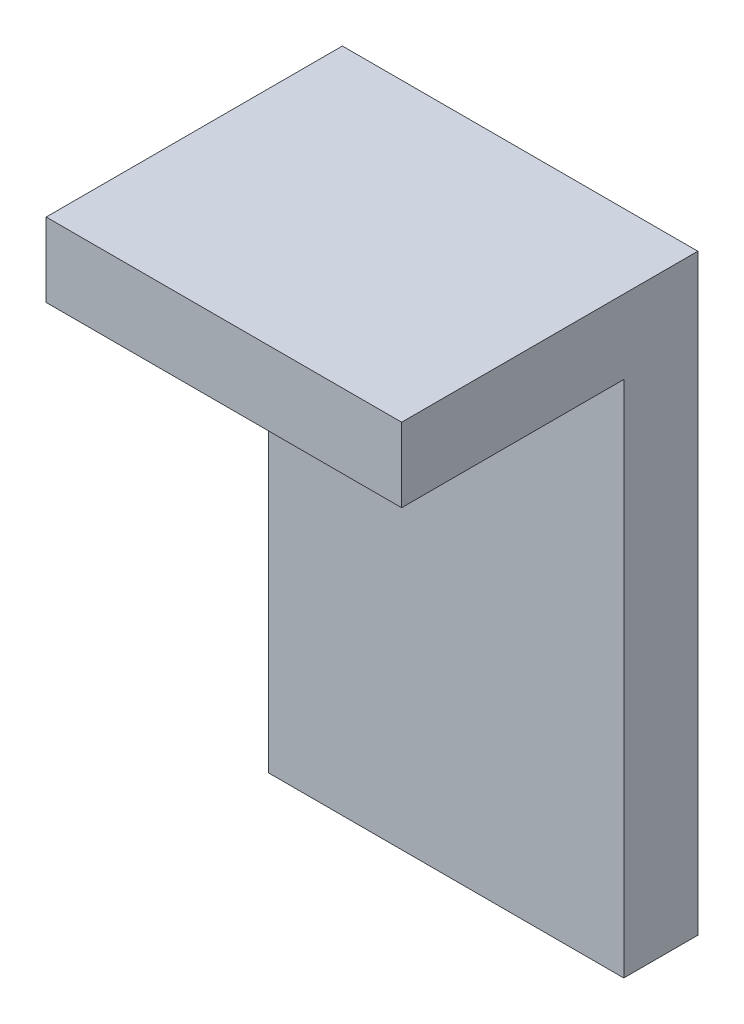
ISO-10303-21;
HEADER;
FILE_DESCRIPTION(('STEP AP214'),'2;1');
FILE_NAME('part.step','',(''),(''),'','','');
FILE_SCHEMA(('AUTOMOTIVE_DESIGN { 1 0 10303 214 1 1 1 1 }'));
ENDSEC;
DATA;
#1=APPLICATION_CONTEXT('core data for automotive mechanical design processes');
#2=APPLICATION_PROTOCOL_DEFINITION('international standard','automotive_design',2000,#1);
#3=PRODUCT_CONTEXT('',#1,'mechanical');
#4=PRODUCT('Part','Part','',(#3));
#5=PRODUCT_RELATED_PRODUCT_CATEGORY('part','',(#4));
#6=PRODUCT_DEFINITION_FORMATION('','',#4);
#7=PRODUCT_DEFINITION_CONTEXT('part definition',#1,'design');
#8=PRODUCT_DEFINITION('design','',#6,#7);
#9=PRODUCT_DEFINITION_SHAPE('','',#8);
#10=(LENGTH_UNIT() NAMED_UNIT(*) SI_UNIT(.MILLI.,.METRE.));
#11=(NAMED_UNIT(*) PLANE_ANGLE_UNIT() SI_UNIT($,.RADIAN.));
#12=(NAMED_UNIT(*) SI_UNIT($,.STERADIAN.) SOLID_ANGLE_UNIT());
#13=UNCERTAINTY_MEASURE_WITH_UNIT(LENGTH_MEASURE(1.E-05),#10,'distance_accuracy_value','');
#14=(GEOMETRIC_REPRESENTATION_CONTEXT(3) GLOBAL_UNCERTAINTY_ASSIGNED_CONTEXT((#13)) GLOBAL_UNIT_ASSIGNED_CONTEXT((#10,
#11,#12)) REPRESENTATION_CONTEXT('',''));
#15=CARTESIAN_POINT('',(0.,0.,0.));
#16=DIRECTION('',(0.,0.,1.));
#17=DIRECTION('',(1.,0.,0.));
#18=AXIS2_PLACEMENT_3D('',#15,#16,#17);
#19=CARTESIAN_POINT('',(1.12,1.1,0.));
#20=DIRECTION('',(0.,0.,1.));
#21=DIRECTION('',(0.,-1.,0.));
#22=AXIS2_PLACEMENT_3D('',#19,#20,#21);
#23=PLANE('',#22);
#24=DIRECTION('',(1.,0.,0.));
#25=VECTOR('',#24,1.);
#26=CARTESIAN_POINT('',(1.12,1.1,0.));
#27=LINE('',#26,#25);
#28=CARTESIAN_POINT('',(0.88,1.1,0.));
#29=VERTEX_POINT('',#28);
#30=CARTESIAN_POINT('',(1.12,1.1,0.));
#31=VERTEX_POINT('',#30);
#32=EDGE_CURVE('E109',#29,#31,#27,.T.);
#33=ORIENTED_EDGE('',*,*,#32,.T.);
#34=DIRECTION('',(0.,1.,0.));
#35=VECTOR('',#34,1.);
#36=CARTESIAN_POINT('',(1.12,1.1,0.));
#37=LINE('',#36,#35);
#38=CARTESIAN_POINT('',(1.12,1.45,0.));
#39=VERTEX_POINT('',#38);
#40=EDGE_CURVE('E101',#31,#39,#37,.T.);
#41=ORIENTED_EDGE('',*,*,#40,.T.);
#42=DIRECTION('',(1.,0.,0.));
#43=VECTOR('',#42,1.);
#44=CARTESIAN_POINT('',(0.88,1.45,0.));
#45=LINE('',#44,#43);
#46=CARTESIAN_POINT('',(0.88,1.45,0.));
#47=VERTEX_POINT('',#46);
#48=EDGE_CURVE('E20',#39,#47,#45,.F.);
#49=ORIENTED_EDGE('',*,*,#48,.T.);
#50=DIRECTION('',(0.,1.,0.));
#51=VECTOR('',#50,1.);
#52=CARTESIAN_POINT('',(0.88,1.1,0.));
#53=LINE('',#52,#51);
#54=EDGE_CURVE('E99',#47,#29,#53,.F.);
#55=ORIENTED_EDGE('',*,*,#54,.T.);
#56=EDGE_LOOP('',(#33,#41,#49,#55));
#57=FACE_BOUND('',#56,.T.);
#58=ADVANCED_FACE('F17',(#57),#23,.T.);
#59=CARTESIAN_POINT('',(0.88,1.45,0.15));
#60=DIRECTION('',(0.,1.,0.));
#61=DIRECTION('',(0.,0.,1.));
#62=AXIS2_PLACEMENT_3D('',#59,#60,#61);
#63=PLANE('',#62);
#64=DIRECTION('',(0.,0.,1.));
#65=VECTOR('',#64,1.);
#66=CARTESIAN_POINT('',(1.12,1.45,-0.05));
#67=LINE('',#66,#65);
#68=CARTESIAN_POINT('',(1.12,1.45,0.15));
#69=VERTEX_POINT('',#68);
#70=EDGE_CURVE('E113',#39,#69,#67,.T.);
#71=ORIENTED_EDGE('',*,*,#70,.T.);
#72=DIRECTION('',(1.,0.,0.));
#73=VECTOR('',#72,1.);
#74=CARTESIAN_POINT('',(1.12,1.45,0.15));
#75=LINE('',#74,#73);
#76=CARTESIAN_POINT('',(0.88,1.45,0.15));
#77=VERTEX_POINT('',#76);
#78=EDGE_CURVE('E67',#69,#77,#75,.F.);
#79=ORIENTED_EDGE('',*,*,#78,.T.);
#80=DIRECTION('',(0.,0.,-1.));
#81=VECTOR('',#80,1.);
#82=CARTESIAN_POINT('',(0.88,1.45,-0.05));
#83=LINE('',#82,#81);
#84=EDGE_CURVE('E90',#77,#47,#83,.T.);
#85=ORIENTED_EDGE('',*,*,#84,.T.);
#86=ORIENTED_EDGE('',*,*,#48,.F.);
#87=EDGE_LOOP('',(#71,#79,#85,#86));
#88=FACE_BOUND('',#87,.T.);
#89=ADVANCED_FACE('F106',(#88),#63,.F.);
#90=CARTESIAN_POINT('',(1.12,1.1,0.15));
#91=DIRECTION('',(0.,0.,-1.));
#92=DIRECTION('',(0.,1.,0.));
#93=AXIS2_PLACEMENT_3D('',#90,#91,#92);
#94=PLANE('',#93);
#95=DIRECTION('',(0.,1.,0.));
#96=VECTOR('',#95,1.);
#97=CARTESIAN_POINT('',(0.88,1.1,0.15));
#98=LINE('',#97,#96);
#99=CARTESIAN_POINT('',(0.88,1.5,0.15));
#100=VERTEX_POINT('',#99);
#101=EDGE_CURVE('E76',#100,#77,#98,.F.);
#102=ORIENTED_EDGE('',*,*,#101,.T.);
#103=ORIENTED_EDGE('',*,*,#78,.F.);
#104=DIRECTION('',(0.,1.,0.));
#105=VECTOR('',#104,1.);
#106=CARTESIAN_POINT('',(1.12,1.1,0.15));
#107=LINE('',#106,#105);
#108=CARTESIAN_POINT('',(1.12,1.5,0.15));
#109=VERTEX_POINT('',#108);
#110=EDGE_CURVE('E78',#69,#109,#107,.T.);
#111=ORIENTED_EDGE('',*,*,#110,.T.);
#112=DIRECTION('',(1.,0.,0.));
#113=VECTOR('',#112,1.);
#114=CARTESIAN_POINT('',(1.12,1.5,0.15));
#115=LINE('',#114,#113);
#116=EDGE_CURVE('E73',#109,#100,#115,.F.);
#117=ORIENTED_EDGE('',*,*,#116,.T.);
#118=EDGE_LOOP('',(#102,#103,#111,#117));
#119=FACE_BOUND('',#118,.T.);
#120=ADVANCED_FACE('F75',(#119),#94,.F.);
#121=CARTESIAN_POINT('',(1.12,1.5,-0.05));
#122=DIRECTION('',(0.,-1.,0.));
#123=DIRECTION('',(0.,0.,-1.));
#124=AXIS2_PLACEMENT_3D('',#121,#122,#123);
#125=PLANE('',#124);
#126=ORIENTED_EDGE('',*,*,#116,.F.);
#127=DIRECTION('',(0.,0.,1.));
#128=VECTOR('',#127,1.);
#129=CARTESIAN_POINT('',(1.12,1.5,-0.05));
#130=LINE('',#129,#128);
#131=CARTESIAN_POINT('',(1.12,1.5,-0.05));
#132=VERTEX_POINT('',#131);
#133=EDGE_CURVE('E116',#109,#132,#130,.F.);
#134=ORIENTED_EDGE('',*,*,#133,.T.);
#135=DIRECTION('',(1.,0.,0.));
#136=VECTOR('',#135,1.);
#137=CARTESIAN_POINT('',(1.12,1.5,-0.0500000000000001));
#138=LINE('',#137,#136);
#139=CARTESIAN_POINT('',(0.88,1.5,-0.05));
#140=VERTEX_POINT('',#139);
#141=EDGE_CURVE('E94',#132,#140,#138,.F.);
#142=ORIENTED_EDGE('',*,*,#141,.T.);
#143=DIRECTION('',(0.,0.,-1.));
#144=VECTOR('',#143,1.);
#145=CARTESIAN_POINT('',(0.88,1.5,-0.05));
#146=LINE('',#145,#144);
#147=EDGE_CURVE('E83',#140,#100,#146,.F.);
#148=ORIENTED_EDGE('',*,*,#147,.T.);
#149=EDGE_LOOP('',(#126,#134,#142,#148));
#150=FACE_BOUND('',#149,.T.);
#151=ADVANCED_FACE('F93',(#150),#125,.F.);
#152=CARTESIAN_POINT('',(0.88,1.1,-0.05));
#153=DIRECTION('',(1.,0.,0.));
#154=DIRECTION('',(0.,0.,-1.));
#155=AXIS2_PLACEMENT_3D('',#152,#153,#154);
#156=PLANE('',#155);
#157=ORIENTED_EDGE('',*,*,#84,.F.);
#158=ORIENTED_EDGE('',*,*,#101,.F.);
#159=ORIENTED_EDGE('',*,*,#147,.F.);
#160=DIRECTION('',(0.,-1.,0.));
#161=VECTOR('',#160,1.);
#162=CARTESIAN_POINT('',(0.88,1.1,-0.05));
#163=LINE('',#162,#161);
#164=CARTESIAN_POINT('',(0.88,1.1,-0.05));
#165=VERTEX_POINT('',#164);
#166=EDGE_CURVE('E119',#140,#165,#163,.T.);
#167=ORIENTED_EDGE('',*,*,#166,.T.);
#168=DIRECTION('',(0.,0.,1.));
#169=VECTOR('',#168,1.);
#170=CARTESIAN_POINT('',(0.88,1.1,-0.05));
#171=LINE('',#170,#169);
#172=EDGE_CURVE('E104',#165,#29,#171,.T.);
#173=ORIENTED_EDGE('',*,*,#172,.T.);
#174=ORIENTED_EDGE('',*,*,#54,.F.);
#175=EDGE_LOOP('',(#157,#158,#159,#167,#173,#174));
#176=FACE_BOUND('',#175,.T.);
#177=ADVANCED_FACE('F86',(#176),#156,.F.);
#178=CARTESIAN_POINT('',(1.12,1.1,-0.05));
#179=DIRECTION('',(0.,1.,0.));
#180=DIRECTION('',(0.,0.,1.));
#181=AXIS2_PLACEMENT_3D('',#178,#179,#180);
#182=PLANE('',#181);
#183=ORIENTED_EDGE('',*,*,#172,.F.);
#184=DIRECTION('',(1.,0.,0.));
#185=VECTOR('',#184,1.);
#186=CARTESIAN_POINT('',(1.12,1.1,-0.05));
#187=LINE('',#186,#185);
#188=CARTESIAN_POINT('',(1.12,1.1,-0.05));
#189=VERTEX_POINT('',#188);
#190=EDGE_CURVE('E26',#165,#189,#187,.T.);
#191=ORIENTED_EDGE('',*,*,#190,.T.);
#192=DIRECTION('',(0.,0.,1.));
#193=VECTOR('',#192,1.);
#194=CARTESIAN_POINT('',(1.12,1.1,-0.05));
#195=LINE('',#194,#193);
#196=EDGE_CURVE('E34',#189,#31,#195,.T.);
#197=ORIENTED_EDGE('',*,*,#196,.T.);
#198=ORIENTED_EDGE('',*,*,#32,.F.);
#199=EDGE_LOOP('',(#183,#191,#197,#198));
#200=FACE_BOUND('',#199,.T.);
#201=ADVANCED_FACE('F124',(#200),#182,.F.);
#202=CARTESIAN_POINT('',(1.12,1.1,-0.05));
#203=DIRECTION('',(-1.,0.,0.));
#204=DIRECTION('',(0.,0.,1.));
#205=AXIS2_PLACEMENT_3D('',#202,#203,#204);
#206=PLANE('',#205);
#207=ORIENTED_EDGE('',*,*,#110,.F.);
#208=ORIENTED_EDGE('',*,*,#70,.F.);
#209=ORIENTED_EDGE('',*,*,#40,.F.);
#210=ORIENTED_EDGE('',*,*,#196,.F.);
#211=DIRECTION('',(0.,-1.,0.));
#212=VECTOR('',#211,1.);
#213=CARTESIAN_POINT('',(1.12,1.1,-0.05));
#214=LINE('',#213,#212);
#215=EDGE_CURVE('E11',#189,#132,#214,.F.);
#216=ORIENTED_EDGE('',*,*,#215,.T.);
#217=ORIENTED_EDGE('',*,*,#133,.F.);
#218=EDGE_LOOP('',(#207,#208,#209,#210,#216,#217));
#219=FACE_BOUND('',#218,.T.);
#220=ADVANCED_FACE('F127',(#219),#206,.F.);
#221=CARTESIAN_POINT('',(1.12,1.1,-0.05));
#222=DIRECTION('',(0.,0.,1.));
#223=DIRECTION('',(0.,-1.,0.));
#224=AXIS2_PLACEMENT_3D('',#221,#222,#223);
#225=PLANE('',#224);
#226=ORIENTED_EDGE('',*,*,#190,.F.);
#227=ORIENTED_EDGE('',*,*,#166,.F.);
#228=ORIENTED_EDGE('',*,*,#141,.F.);
#229=ORIENTED_EDGE('',*,*,#215,.F.);
#230=EDGE_LOOP('',(#226,#227,#228,#229));
#231=FACE_BOUND('',#230,.T.);
#232=ADVANCED_FACE('F126',(#231),#225,.F.);
#233=CLOSED_SHELL('',(#58,#89,#120,#151,#177,#201,#220,#232));
#234=MANIFOLD_SOLID_BREP('B1',#233);
#235=ADVANCED_BREP_SHAPE_REPRESENTATION('',(#18,#234),#14);
#236=SHAPE_DEFINITION_REPRESENTATION(#9,#235);
ENDSEC;
END-ISO-10303-21;
